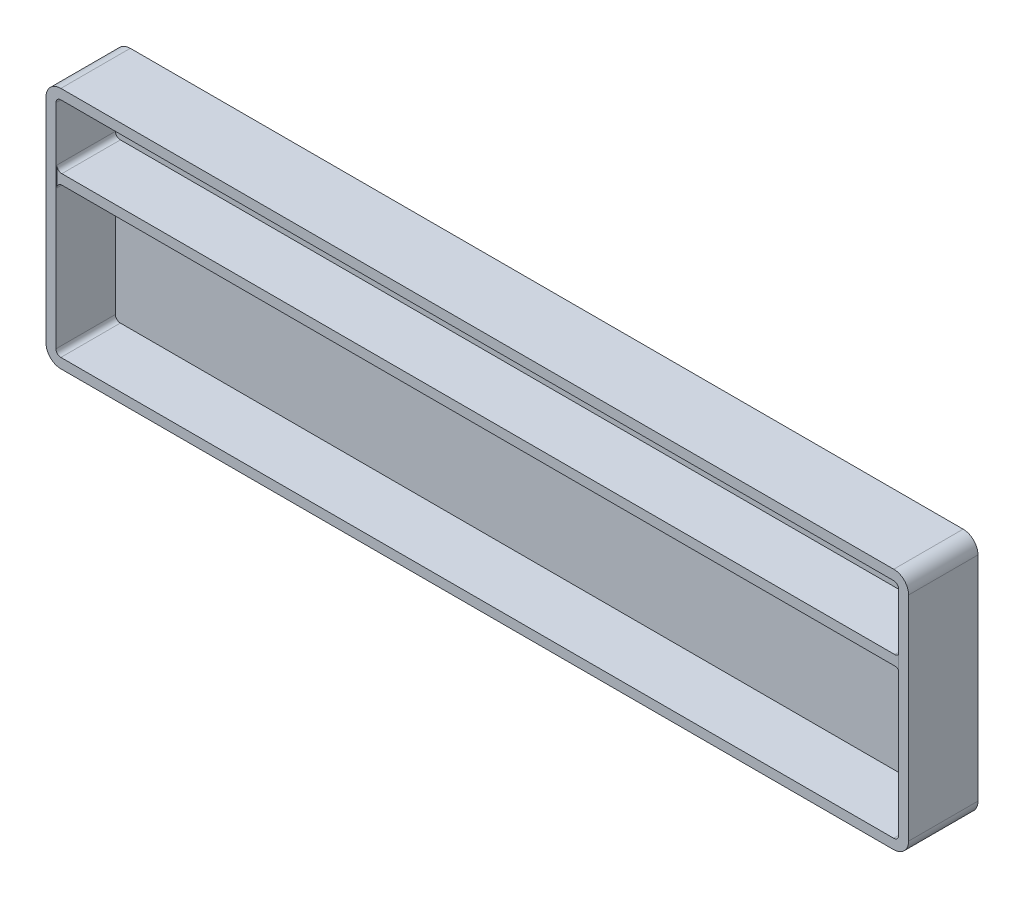
ISO-10303-21;
HEADER;
FILE_DESCRIPTION(('STEP AP214'),'2;1');
FILE_NAME('part.step','',(''),(''),'','','');
FILE_SCHEMA(('AUTOMOTIVE_DESIGN { 1 0 10303 214 1 1 1 1 }'));
ENDSEC;
DATA;
#1=APPLICATION_CONTEXT('core data for automotive mechanical design processes');
#2=APPLICATION_PROTOCOL_DEFINITION('international standard','automotive_design',2000,#1);
#3=PRODUCT_CONTEXT('',#1,'mechanical');
#4=PRODUCT('Part','Part','',(#3));
#5=PRODUCT_RELATED_PRODUCT_CATEGORY('part','',(#4));
#6=PRODUCT_DEFINITION_FORMATION('','',#4);
#7=PRODUCT_DEFINITION_CONTEXT('part definition',#1,'design');
#8=PRODUCT_DEFINITION('design','',#6,#7);
#9=PRODUCT_DEFINITION_SHAPE('','',#8);
#10=(LENGTH_UNIT() NAMED_UNIT(*) SI_UNIT(.MILLI.,.METRE.));
#11=(NAMED_UNIT(*) PLANE_ANGLE_UNIT() SI_UNIT($,.RADIAN.));
#12=(NAMED_UNIT(*) SI_UNIT($,.STERADIAN.) SOLID_ANGLE_UNIT());
#13=UNCERTAINTY_MEASURE_WITH_UNIT(LENGTH_MEASURE(1.E-05),#10,'distance_accuracy_value','');
#14=(GEOMETRIC_REPRESENTATION_CONTEXT(3) GLOBAL_UNCERTAINTY_ASSIGNED_CONTEXT((#13)) GLOBAL_UNIT_ASSIGNED_CONTEXT((#10,
#11,#12)) REPRESENTATION_CONTEXT('',''));
#15=CARTESIAN_POINT('',(0.,0.,0.));
#16=DIRECTION('',(0.,0.,1.));
#17=DIRECTION('',(1.,0.,0.));
#18=AXIS2_PLACEMENT_3D('',#15,#16,#17);
#19=CARTESIAN_POINT('',(0.,0.,12.));
#20=DIRECTION('',(0.,0.,-1.));
#21=DIRECTION('',(-1.,0.,0.));
#22=AXIS2_PLACEMENT_3D('',#19,#20,#21);
#23=PLANE('',#22);
#24=CARTESIAN_POINT('',(84.,21.5,12.));
#25=DIRECTION('',(0.,0.,-1.));
#26=DIRECTION('',(-1.,0.,0.));
#27=AXIS2_PLACEMENT_3D('',#24,#25,#26);
#28=CIRCLE('',#27,3.);
#29=CARTESIAN_POINT('',(87.,21.5,12.));
#30=VERTEX_POINT('',#29);
#31=CARTESIAN_POINT('',(84.,24.5,12.));
#32=VERTEX_POINT('',#31);
#33=EDGE_CURVE('E39',#30,#32,#28,.F.);
#34=ORIENTED_EDGE('',*,*,#33,.T.);
#35=DIRECTION('',(-1.,0.,0.));
#36=VECTOR('',#35,1.);
#37=CARTESIAN_POINT('',(-85.,24.5,12.));
#38=LINE('',#37,#36);
#39=CARTESIAN_POINT('',(-84.,24.5,12.));
#40=VERTEX_POINT('',#39);
#41=EDGE_CURVE('E319',#32,#40,#38,.T.);
#42=ORIENTED_EDGE('',*,*,#41,.T.);
#43=CARTESIAN_POINT('',(-84.,21.5,12.));
#44=DIRECTION('',(0.,0.,-1.));
#45=DIRECTION('',(-1.,0.,0.));
#46=AXIS2_PLACEMENT_3D('',#43,#44,#45);
#47=CIRCLE('',#46,3.);
#48=CARTESIAN_POINT('',(-87.,21.5,12.));
#49=VERTEX_POINT('',#48);
#50=EDGE_CURVE('E316',#40,#49,#47,.F.);
#51=ORIENTED_EDGE('',*,*,#50,.T.);
#52=DIRECTION('',(0.,-1.,0.));
#53=VECTOR('',#52,1.);
#54=CARTESIAN_POINT('',(-87.,22.5,12.));
#55=LINE('',#54,#53);
#56=CARTESIAN_POINT('',(-87.,-21.5,12.));
#57=VERTEX_POINT('',#56);
#58=EDGE_CURVE('E317',#49,#57,#55,.T.);
#59=ORIENTED_EDGE('',*,*,#58,.T.);
#60=CARTESIAN_POINT('',(-84.,-21.5,12.));
#61=DIRECTION('',(0.,0.,-1.));
#62=DIRECTION('',(-1.,0.,0.));
#63=AXIS2_PLACEMENT_3D('',#60,#61,#62);
#64=CIRCLE('',#63,3.);
#65=CARTESIAN_POINT('',(-84.,-24.5,12.));
#66=VERTEX_POINT('',#65);
#67=EDGE_CURVE('E59',#57,#66,#64,.F.);
#68=ORIENTED_EDGE('',*,*,#67,.T.);
#69=DIRECTION('',(1.,0.,0.));
#70=VECTOR('',#69,1.);
#71=CARTESIAN_POINT('',(-85.,-24.5,12.));
#72=LINE('',#71,#70);
#73=CARTESIAN_POINT('',(84.,-24.5,12.));
#74=VERTEX_POINT('',#73);
#75=EDGE_CURVE('E52',#66,#74,#72,.T.);
#76=ORIENTED_EDGE('',*,*,#75,.T.);
#77=CARTESIAN_POINT('',(84.,-21.5,12.));
#78=DIRECTION('',(0.,0.,-1.));
#79=DIRECTION('',(-1.,0.,0.));
#80=AXIS2_PLACEMENT_3D('',#77,#78,#79);
#81=CIRCLE('',#80,3.);
#82=CARTESIAN_POINT('',(87.,-21.5,12.));
#83=VERTEX_POINT('',#82);
#84=EDGE_CURVE('E323',#74,#83,#81,.F.);
#85=ORIENTED_EDGE('',*,*,#84,.T.);
#86=DIRECTION('',(0.,1.,0.));
#87=VECTOR('',#86,1.);
#88=CARTESIAN_POINT('',(87.,22.5,12.));
#89=LINE('',#88,#87);
#90=EDGE_CURVE('E206',#83,#30,#89,.T.);
#91=ORIENTED_EDGE('',*,*,#90,.T.);
#92=EDGE_LOOP('',(#34,#42,#51,#59,#68,#76,#85,#91));
#93=FACE_BOUND('',#92,.T.);
#94=DIRECTION('',(1.,0.,0.));
#95=VECTOR('',#94,1.);
#96=CARTESIAN_POINT('',(-85.,-22.5,12.));
#97=LINE('',#96,#95);
#98=CARTESIAN_POINT('',(-84.,-22.5,12.));
#99=VERTEX_POINT('',#98);
#100=CARTESIAN_POINT('',(84.,-22.5,12.));
#101=VERTEX_POINT('',#100);
#102=EDGE_CURVE('E609',#99,#101,#97,.T.);
#103=ORIENTED_EDGE('',*,*,#102,.F.);
#104=CARTESIAN_POINT('',(-84.,-21.5,12.));
#105=DIRECTION('',(0.,0.,1.));
#106=DIRECTION('',(1.,0.,0.));
#107=AXIS2_PLACEMENT_3D('',#104,#105,#106);
#108=CIRCLE('',#107,1.);
#109=CARTESIAN_POINT('',(-85.,-21.5,12.));
#110=VERTEX_POINT('',#109);
#111=EDGE_CURVE('E44',#99,#110,#108,.F.);
#112=ORIENTED_EDGE('',*,*,#111,.T.);
#113=DIRECTION('',(0.,-1.,0.));
#114=VECTOR('',#113,1.);
#115=CARTESIAN_POINT('',(-85.,22.5,12.));
#116=LINE('',#115,#114);
#117=CARTESIAN_POINT('',(-85.,21.5,12.));
#118=VERTEX_POINT('',#117);
#119=EDGE_CURVE('E637',#118,#110,#116,.T.);
#120=ORIENTED_EDGE('',*,*,#119,.F.);
#121=CARTESIAN_POINT('',(-84.,21.5,12.));
#122=DIRECTION('',(0.,0.,1.));
#123=DIRECTION('',(1.,0.,0.));
#124=AXIS2_PLACEMENT_3D('',#121,#122,#123);
#125=CIRCLE('',#124,1.);
#126=CARTESIAN_POINT('',(-84.,22.5,12.));
#127=VERTEX_POINT('',#126);
#128=EDGE_CURVE('E12',#118,#127,#125,.F.);
#129=ORIENTED_EDGE('',*,*,#128,.T.);
#130=DIRECTION('',(-1.,0.,0.));
#131=VECTOR('',#130,1.);
#132=CARTESIAN_POINT('',(-85.,22.5,12.));
#133=LINE('',#132,#131);
#134=CARTESIAN_POINT('',(84.,22.5,12.));
#135=VERTEX_POINT('',#134);
#136=EDGE_CURVE('E639',#135,#127,#133,.T.);
#137=ORIENTED_EDGE('',*,*,#136,.F.);
#138=CARTESIAN_POINT('',(84.,21.5,12.));
#139=DIRECTION('',(0.,0.,1.));
#140=DIRECTION('',(1.,0.,0.));
#141=AXIS2_PLACEMENT_3D('',#138,#139,#140);
#142=CIRCLE('',#141,1.);
#143=CARTESIAN_POINT('',(85.,21.5,12.));
#144=VERTEX_POINT('',#143);
#145=EDGE_CURVE('E254',#135,#144,#142,.F.);
#146=ORIENTED_EDGE('',*,*,#145,.T.);
#147=DIRECTION('',(0.,1.,0.));
#148=VECTOR('',#147,1.);
#149=CARTESIAN_POINT('',(85.,22.5,12.));
#150=LINE('',#149,#148);
#151=CARTESIAN_POINT('',(85.,-21.5,12.));
#152=VERTEX_POINT('',#151);
#153=EDGE_CURVE('E644',#152,#144,#150,.T.);
#154=ORIENTED_EDGE('',*,*,#153,.F.);
#155=CARTESIAN_POINT('',(84.,-21.5,12.));
#156=DIRECTION('',(0.,0.,1.));
#157=DIRECTION('',(1.,0.,0.));
#158=AXIS2_PLACEMENT_3D('',#155,#156,#157);
#159=CIRCLE('',#158,1.);
#160=EDGE_CURVE('E257',#152,#101,#159,.F.);
#161=ORIENTED_EDGE('',*,*,#160,.T.);
#162=EDGE_LOOP('',(#103,#112,#120,#129,#137,#146,#154,#161));
#163=FACE_BOUND('',#162,.T.);
#164=ADVANCED_FACE('F36',(#93,#163),#23,.F.);
#165=CARTESIAN_POINT('',(0.,0.,0.));
#166=DIRECTION('',(0.,0.,1.));
#167=DIRECTION('',(1.,0.,0.));
#168=AXIS2_PLACEMENT_3D('',#165,#166,#167);
#169=PLANE('',#168);
#170=DIRECTION('',(-1.,0.,0.));
#171=VECTOR('',#170,1.);
#172=CARTESIAN_POINT('',(-85.,9.5,0.));
#173=LINE('',#172,#171);
#174=CARTESIAN_POINT('',(84.,9.5,0.));
#175=VERTEX_POINT('',#174);
#176=CARTESIAN_POINT('',(-84.,9.5,0.));
#177=VERTEX_POINT('',#176);
#178=EDGE_CURVE('E617',#175,#177,#173,.T.);
#179=ORIENTED_EDGE('',*,*,#178,.F.);
#180=CARTESIAN_POINT('',(84.,10.5,0.));
#181=DIRECTION('',(0.,0.,1.));
#182=DIRECTION('',(1.,0.,0.));
#183=AXIS2_PLACEMENT_3D('',#180,#181,#182);
#184=CIRCLE('',#183,1.);
#185=CARTESIAN_POINT('',(85.,10.5,0.));
#186=VERTEX_POINT('',#185);
#187=EDGE_CURVE('E282',#175,#186,#184,.T.);
#188=ORIENTED_EDGE('',*,*,#187,.T.);
#189=DIRECTION('',(0.,1.,0.));
#190=VECTOR('',#189,1.);
#191=CARTESIAN_POINT('',(85.,22.5,0.));
#192=LINE('',#191,#190);
#193=CARTESIAN_POINT('',(85.,21.5,0.));
#194=VERTEX_POINT('',#193);
#195=EDGE_CURVE('E645',#186,#194,#192,.T.);
#196=ORIENTED_EDGE('',*,*,#195,.T.);
#197=CARTESIAN_POINT('',(84.,21.5,0.));
#198=DIRECTION('',(0.,0.,1.));
#199=DIRECTION('',(1.,0.,0.));
#200=AXIS2_PLACEMENT_3D('',#197,#198,#199);
#201=CIRCLE('',#200,1.);
#202=CARTESIAN_POINT('',(84.,22.5,0.));
#203=VERTEX_POINT('',#202);
#204=EDGE_CURVE('E280',#194,#203,#201,.T.);
#205=ORIENTED_EDGE('',*,*,#204,.T.);
#206=DIRECTION('',(-1.,0.,0.));
#207=VECTOR('',#206,1.);
#208=CARTESIAN_POINT('',(-85.,22.5,0.));
#209=LINE('',#208,#207);
#210=CARTESIAN_POINT('',(-84.,22.5,0.));
#211=VERTEX_POINT('',#210);
#212=EDGE_CURVE('E641',#203,#211,#209,.T.);
#213=ORIENTED_EDGE('',*,*,#212,.T.);
#214=CARTESIAN_POINT('',(-84.,21.5,0.));
#215=DIRECTION('',(0.,0.,1.));
#216=DIRECTION('',(1.,0.,0.));
#217=AXIS2_PLACEMENT_3D('',#214,#215,#216);
#218=CIRCLE('',#217,1.);
#219=CARTESIAN_POINT('',(-85.,21.5,0.));
#220=VERTEX_POINT('',#219);
#221=EDGE_CURVE('E276',#211,#220,#218,.T.);
#222=ORIENTED_EDGE('',*,*,#221,.T.);
#223=DIRECTION('',(0.,-1.,0.));
#224=VECTOR('',#223,1.);
#225=CARTESIAN_POINT('',(-85.,22.5,0.));
#226=LINE('',#225,#224);
#227=CARTESIAN_POINT('',(-85.,10.5,0.));
#228=VERTEX_POINT('',#227);
#229=EDGE_CURVE('E618',#220,#228,#226,.T.);
#230=ORIENTED_EDGE('',*,*,#229,.T.);
#231=CARTESIAN_POINT('',(-84.,10.5,0.));
#232=DIRECTION('',(0.,0.,1.));
#233=DIRECTION('',(1.,0.,0.));
#234=AXIS2_PLACEMENT_3D('',#231,#232,#233);
#235=CIRCLE('',#234,1.);
#236=EDGE_CURVE('E278',#228,#177,#235,.T.);
#237=ORIENTED_EDGE('',*,*,#236,.T.);
#238=EDGE_LOOP('',(#179,#188,#196,#205,#213,#222,#230,#237));
#239=FACE_BOUND('',#238,.T.);
#240=ADVANCED_FACE('F362',(#239),#169,.T.);
#241=DIRECTION('',(1.,0.,0.));
#242=VECTOR('',#241,1.);
#243=CARTESIAN_POINT('',(-85.,-22.5,0.));
#244=LINE('',#243,#242);
#245=CARTESIAN_POINT('',(-84.,-22.5,0.));
#246=VERTEX_POINT('',#245);
#247=CARTESIAN_POINT('',(84.,-22.5,0.));
#248=VERTEX_POINT('',#247);
#249=EDGE_CURVE('E634',#246,#248,#244,.T.);
#250=ORIENTED_EDGE('',*,*,#249,.T.);
#251=CARTESIAN_POINT('',(84.,-21.5,0.));
#252=DIRECTION('',(0.,0.,1.));
#253=DIRECTION('',(1.,0.,0.));
#254=AXIS2_PLACEMENT_3D('',#251,#252,#253);
#255=CIRCLE('',#254,1.);
#256=CARTESIAN_POINT('',(85.,-21.5,0.));
#257=VERTEX_POINT('',#256);
#258=EDGE_CURVE('E269',#248,#257,#255,.T.);
#259=ORIENTED_EDGE('',*,*,#258,.T.);
#260=CARTESIAN_POINT('',(85.,6.50000000000001,0.));
#261=VERTEX_POINT('',#260);
#262=EDGE_CURVE('E631',#257,#261,#192,.T.);
#263=ORIENTED_EDGE('',*,*,#262,.T.);
#264=CARTESIAN_POINT('',(84.,6.5,0.));
#265=DIRECTION('',(0.,0.,1.));
#266=DIRECTION('',(1.,0.,0.));
#267=AXIS2_PLACEMENT_3D('',#264,#265,#266);
#268=CIRCLE('',#267,1.);
#269=CARTESIAN_POINT('',(84.,7.5,0.));
#270=VERTEX_POINT('',#269);
#271=EDGE_CURVE('E267',#261,#270,#268,.T.);
#272=ORIENTED_EDGE('',*,*,#271,.T.);
#273=DIRECTION('',(1.,0.,0.));
#274=VECTOR('',#273,1.);
#275=CARTESIAN_POINT('',(-85.,7.5,0.));
#276=LINE('',#275,#274);
#277=CARTESIAN_POINT('',(-84.,7.5,0.));
#278=VERTEX_POINT('',#277);
#279=EDGE_CURVE('E620',#278,#270,#276,.T.);
#280=ORIENTED_EDGE('',*,*,#279,.F.);
#281=CARTESIAN_POINT('',(-84.,6.5,0.));
#282=DIRECTION('',(0.,0.,1.));
#283=DIRECTION('',(1.,0.,0.));
#284=AXIS2_PLACEMENT_3D('',#281,#282,#283);
#285=CIRCLE('',#284,1.);
#286=CARTESIAN_POINT('',(-85.,6.50000000000001,0.));
#287=VERTEX_POINT('',#286);
#288=EDGE_CURVE('E263',#278,#287,#285,.T.);
#289=ORIENTED_EDGE('',*,*,#288,.T.);
#290=CARTESIAN_POINT('',(-85.,-21.5,0.));
#291=VERTEX_POINT('',#290);
#292=EDGE_CURVE('E640',#287,#291,#226,.T.);
#293=ORIENTED_EDGE('',*,*,#292,.T.);
#294=CARTESIAN_POINT('',(-84.,-21.5,0.));
#295=DIRECTION('',(0.,0.,1.));
#296=DIRECTION('',(1.,0.,0.));
#297=AXIS2_PLACEMENT_3D('',#294,#295,#296);
#298=CIRCLE('',#297,1.);
#299=EDGE_CURVE('E265',#291,#246,#298,.T.);
#300=ORIENTED_EDGE('',*,*,#299,.T.);
#301=EDGE_LOOP('',(#250,#259,#263,#272,#280,#289,#293,#300));
#302=FACE_BOUND('',#301,.T.);
#303=ADVANCED_FACE('F367',(#302),#169,.T.);
#304=CARTESIAN_POINT('',(-85.,22.5,0.));
#305=DIRECTION('',(-1.,0.,0.));
#306=DIRECTION('',(0.,0.,1.));
#307=AXIS2_PLACEMENT_3D('',#304,#305,#306);
#308=PLANE('',#307);
#309=DIRECTION('',(0.,-1.,0.));
#310=VECTOR('',#309,1.);
#311=CARTESIAN_POINT('',(-85.,9.5,11.8));
#312=LINE('',#311,#310);
#313=CARTESIAN_POINT('',(-85.,10.5,11.8));
#314=VERTEX_POINT('',#313);
#315=CARTESIAN_POINT('',(-85.,6.5,11.8));
#316=VERTEX_POINT('',#315);
#317=EDGE_CURVE('E602',#314,#316,#312,.T.);
#318=ORIENTED_EDGE('',*,*,#317,.F.);
#319=DIRECTION('',(0.,0.,-1.));
#320=VECTOR('',#319,1.);
#321=CARTESIAN_POINT('',(-85.,10.5,0.));
#322=LINE('',#321,#320);
#323=EDGE_CURVE('E302',#314,#228,#322,.T.);
#324=ORIENTED_EDGE('',*,*,#323,.T.);
#325=ORIENTED_EDGE('',*,*,#229,.F.);
#326=DIRECTION('',(0.,0.,1.));
#327=VECTOR('',#326,1.);
#328=CARTESIAN_POINT('',(-85.,21.5,12.));
#329=LINE('',#328,#327);
#330=EDGE_CURVE('E294',#220,#118,#329,.T.);
#331=ORIENTED_EDGE('',*,*,#330,.T.);
#332=ORIENTED_EDGE('',*,*,#119,.T.);
#333=DIRECTION('',(0.,0.,1.));
#334=VECTOR('',#333,1.);
#335=CARTESIAN_POINT('',(-85.,-21.5,0.));
#336=LINE('',#335,#334);
#337=EDGE_CURVE('E300',#110,#291,#336,.F.);
#338=ORIENTED_EDGE('',*,*,#337,.T.);
#339=ORIENTED_EDGE('',*,*,#292,.F.);
#340=DIRECTION('',(0.,0.,-1.));
#341=VECTOR('',#340,1.);
#342=CARTESIAN_POINT('',(-85.,6.5,11.8000000000001));
#343=LINE('',#342,#341);
#344=EDGE_CURVE('E297',#287,#316,#343,.F.);
#345=ORIENTED_EDGE('',*,*,#344,.T.);
#346=EDGE_LOOP('',(#318,#324,#325,#331,#332,#338,#339,#345));
#347=FACE_BOUND('',#346,.T.);
#348=ADVANCED_FACE('F375',(#347),#308,.F.);
#349=CARTESIAN_POINT('',(85.,22.5,0.));
#350=DIRECTION('',(1.,0.,0.));
#351=DIRECTION('',(0.,0.,-1.));
#352=AXIS2_PLACEMENT_3D('',#349,#350,#351);
#353=PLANE('',#352);
#354=ORIENTED_EDGE('',*,*,#262,.F.);
#355=DIRECTION('',(0.,0.,1.));
#356=VECTOR('',#355,1.);
#357=CARTESIAN_POINT('',(85.,-21.5,12.));
#358=LINE('',#357,#356);
#359=EDGE_CURVE('E248',#257,#152,#358,.T.);
#360=ORIENTED_EDGE('',*,*,#359,.T.);
#361=ORIENTED_EDGE('',*,*,#153,.T.);
#362=DIRECTION('',(0.,0.,1.));
#363=VECTOR('',#362,1.);
#364=CARTESIAN_POINT('',(85.,21.5,0.));
#365=LINE('',#364,#363);
#366=EDGE_CURVE('E240',#144,#194,#365,.F.);
#367=ORIENTED_EDGE('',*,*,#366,.T.);
#368=ORIENTED_EDGE('',*,*,#195,.F.);
#369=DIRECTION('',(0.,0.,-1.));
#370=VECTOR('',#369,1.);
#371=CARTESIAN_POINT('',(85.,10.5,11.8000000000001));
#372=LINE('',#371,#370);
#373=CARTESIAN_POINT('',(85.,10.5,11.8));
#374=VERTEX_POINT('',#373);
#375=EDGE_CURVE('E245',#186,#374,#372,.F.);
#376=ORIENTED_EDGE('',*,*,#375,.T.);
#377=DIRECTION('',(0.,1.,0.));
#378=VECTOR('',#377,1.);
#379=CARTESIAN_POINT('',(85.,9.5,11.8));
#380=LINE('',#379,#378);
#381=CARTESIAN_POINT('',(85.,6.5,11.8));
#382=VERTEX_POINT('',#381);
#383=EDGE_CURVE('E627',#382,#374,#380,.T.);
#384=ORIENTED_EDGE('',*,*,#383,.F.);
#385=DIRECTION('',(0.,0.,-1.));
#386=VECTOR('',#385,1.);
#387=CARTESIAN_POINT('',(85.,6.5,0.));
#388=LINE('',#387,#386);
#389=EDGE_CURVE('E242',#382,#261,#388,.T.);
#390=ORIENTED_EDGE('',*,*,#389,.T.);
#391=EDGE_LOOP('',(#354,#360,#361,#367,#368,#376,#384,#390));
#392=FACE_BOUND('',#391,.T.);
#393=ADVANCED_FACE('F380',(#392),#353,.F.);
#394=CARTESIAN_POINT('',(-85.,-22.5,0.));
#395=DIRECTION('',(0.,-1.,0.));
#396=DIRECTION('',(0.,0.,-1.));
#397=AXIS2_PLACEMENT_3D('',#394,#395,#396);
#398=PLANE('',#397);
#399=ORIENTED_EDGE('',*,*,#102,.T.);
#400=DIRECTION('',(0.,0.,1.));
#401=VECTOR('',#400,1.);
#402=CARTESIAN_POINT('',(84.,-22.5,0.));
#403=LINE('',#402,#401);
#404=EDGE_CURVE('E261',#101,#248,#403,.F.);
#405=ORIENTED_EDGE('',*,*,#404,.T.);
#406=ORIENTED_EDGE('',*,*,#249,.F.);
#407=DIRECTION('',(0.,0.,1.));
#408=VECTOR('',#407,1.);
#409=CARTESIAN_POINT('',(-84.,-22.5,12.));
#410=LINE('',#409,#408);
#411=EDGE_CURVE('E250',#246,#99,#410,.T.);
#412=ORIENTED_EDGE('',*,*,#411,.T.);
#413=EDGE_LOOP('',(#399,#405,#406,#412));
#414=FACE_BOUND('',#413,.T.);
#415=ADVANCED_FACE('F554',(#414),#398,.F.);
#416=CARTESIAN_POINT('',(-85.,22.5,0.));
#417=DIRECTION('',(0.,1.,0.));
#418=DIRECTION('',(0.,0.,1.));
#419=AXIS2_PLACEMENT_3D('',#416,#417,#418);
#420=PLANE('',#419);
#421=ORIENTED_EDGE('',*,*,#212,.F.);
#422=DIRECTION('',(0.,0.,1.));
#423=VECTOR('',#422,1.);
#424=CARTESIAN_POINT('',(84.,22.5,12.));
#425=LINE('',#424,#423);
#426=EDGE_CURVE('E291',#203,#135,#425,.T.);
#427=ORIENTED_EDGE('',*,*,#426,.T.);
#428=ORIENTED_EDGE('',*,*,#136,.T.);
#429=DIRECTION('',(0.,0.,1.));
#430=VECTOR('',#429,1.);
#431=CARTESIAN_POINT('',(-84.,22.5,0.));
#432=LINE('',#431,#430);
#433=EDGE_CURVE('E289',#127,#211,#432,.F.);
#434=ORIENTED_EDGE('',*,*,#433,.T.);
#435=EDGE_LOOP('',(#421,#427,#428,#434));
#436=FACE_BOUND('',#435,.T.);
#437=ADVANCED_FACE('F545',(#436),#420,.F.);
#438=CARTESIAN_POINT('',(-85.,9.5,182.011764298827));
#439=DIRECTION('',(0.,-1.,0.));
#440=DIRECTION('',(0.,0.,-1.));
#441=AXIS2_PLACEMENT_3D('',#438,#439,#440);
#442=PLANE('',#441);
#443=DIRECTION('',(-1.,0.,0.));
#444=VECTOR('',#443,1.);
#445=CARTESIAN_POINT('',(-85.,9.5,11.8));
#446=LINE('',#445,#444);
#447=CARTESIAN_POINT('',(84.,9.5,11.8));
#448=VERTEX_POINT('',#447);
#449=CARTESIAN_POINT('',(-84.,9.5,11.8));
#450=VERTEX_POINT('',#449);
#451=EDGE_CURVE('E610',#448,#450,#446,.T.);
#452=ORIENTED_EDGE('',*,*,#451,.F.);
#453=DIRECTION('',(0.,0.,-1.));
#454=VECTOR('',#453,1.);
#455=CARTESIAN_POINT('',(84.,9.5,0.));
#456=LINE('',#455,#454);
#457=EDGE_CURVE('E273',#448,#175,#456,.T.);
#458=ORIENTED_EDGE('',*,*,#457,.T.);
#459=ORIENTED_EDGE('',*,*,#178,.T.);
#460=DIRECTION('',(0.,0.,-1.));
#461=VECTOR('',#460,1.);
#462=CARTESIAN_POINT('',(-84.,9.5,11.8000000000001));
#463=LINE('',#462,#461);
#464=EDGE_CURVE('E271',#177,#450,#463,.F.);
#465=ORIENTED_EDGE('',*,*,#464,.T.);
#466=EDGE_LOOP('',(#452,#458,#459,#465));
#467=FACE_BOUND('',#466,.T.);
#468=ADVANCED_FACE('F538',(#467),#442,.F.);
#469=CARTESIAN_POINT('',(-85.,7.5,182.011764298827));
#470=DIRECTION('',(0.,1.,0.));
#471=DIRECTION('',(0.,0.,1.));
#472=AXIS2_PLACEMENT_3D('',#469,#470,#471);
#473=PLANE('',#472);
#474=ORIENTED_EDGE('',*,*,#279,.T.);
#475=DIRECTION('',(0.,0.,-1.));
#476=VECTOR('',#475,1.);
#477=CARTESIAN_POINT('',(84.,7.5,11.8));
#478=LINE('',#477,#476);
#479=CARTESIAN_POINT('',(84.,7.5,11.8));
#480=VERTEX_POINT('',#479);
#481=EDGE_CURVE('E287',#270,#480,#478,.F.);
#482=ORIENTED_EDGE('',*,*,#481,.T.);
#483=DIRECTION('',(1.,0.,0.));
#484=VECTOR('',#483,1.);
#485=CARTESIAN_POINT('',(-85.,7.5,11.8));
#486=LINE('',#485,#484);
#487=CARTESIAN_POINT('',(-84.,7.5,11.8));
#488=VERTEX_POINT('',#487);
#489=EDGE_CURVE('E623',#488,#480,#486,.T.);
#490=ORIENTED_EDGE('',*,*,#489,.F.);
#491=DIRECTION('',(0.,0.,-1.));
#492=VECTOR('',#491,1.);
#493=CARTESIAN_POINT('',(-84.,7.5,0.));
#494=LINE('',#493,#492);
#495=EDGE_CURVE('E284',#488,#278,#494,.T.);
#496=ORIENTED_EDGE('',*,*,#495,.T.);
#497=EDGE_LOOP('',(#474,#482,#490,#496));
#498=FACE_BOUND('',#497,.T.);
#499=ADVANCED_FACE('F530',(#498),#473,.F.);
#500=CARTESIAN_POINT('',(0.,0.,11.8));
#501=DIRECTION('',(0.,0.,1.));
#502=DIRECTION('',(1.,0.,0.));
#503=AXIS2_PLACEMENT_3D('',#500,#501,#502);
#504=PLANE('',#503);
#505=ORIENTED_EDGE('',*,*,#317,.T.);
#506=CARTESIAN_POINT('',(-84.,6.5,11.8));
#507=DIRECTION('',(0.,0.,1.));
#508=DIRECTION('',(1.,0.,0.));
#509=AXIS2_PLACEMENT_3D('',#506,#507,#508);
#510=CIRCLE('',#509,1.);
#511=EDGE_CURVE('E313',#316,#488,#510,.F.);
#512=ORIENTED_EDGE('',*,*,#511,.T.);
#513=ORIENTED_EDGE('',*,*,#489,.T.);
#514=CARTESIAN_POINT('',(84.,6.5,11.8));
#515=DIRECTION('',(0.,0.,1.));
#516=DIRECTION('',(1.,0.,0.));
#517=AXIS2_PLACEMENT_3D('',#514,#515,#516);
#518=CIRCLE('',#517,1.);
#519=EDGE_CURVE('E307',#480,#382,#518,.F.);
#520=ORIENTED_EDGE('',*,*,#519,.T.);
#521=ORIENTED_EDGE('',*,*,#383,.T.);
#522=CARTESIAN_POINT('',(84.,10.5,11.8));
#523=DIRECTION('',(0.,0.,1.));
#524=DIRECTION('',(1.,0.,0.));
#525=AXIS2_PLACEMENT_3D('',#522,#523,#524);
#526=CIRCLE('',#525,1.);
#527=EDGE_CURVE('E305',#374,#448,#526,.F.);
#528=ORIENTED_EDGE('',*,*,#527,.T.);
#529=ORIENTED_EDGE('',*,*,#451,.T.);
#530=CARTESIAN_POINT('',(-84.,10.5,11.8));
#531=DIRECTION('',(0.,0.,1.));
#532=DIRECTION('',(1.,0.,0.));
#533=AXIS2_PLACEMENT_3D('',#530,#531,#532);
#534=CIRCLE('',#533,1.);
#535=EDGE_CURVE('E310',#450,#314,#534,.F.);
#536=ORIENTED_EDGE('',*,*,#535,.T.);
#537=EDGE_LOOP('',(#505,#512,#513,#520,#521,#528,#529,#536));
#538=FACE_BOUND('',#537,.T.);
#539=ADVANCED_FACE('F412',(#538),#504,.T.);
#540=CARTESIAN_POINT('',(84.,-21.5,0.));
#541=DIRECTION('',(0.,0.,-1.));
#542=DIRECTION('',(-1.,0.,0.));
#543=AXIS2_PLACEMENT_3D('',#540,#541,#542);
#544=CYLINDRICAL_SURFACE('',#543,1.);
#545=ORIENTED_EDGE('',*,*,#258,.F.);
#546=ORIENTED_EDGE('',*,*,#404,.F.);
#547=ORIENTED_EDGE('',*,*,#160,.F.);
#548=ORIENTED_EDGE('',*,*,#359,.F.);
#549=EDGE_LOOP('',(#545,#546,#547,#548));
#550=FACE_BOUND('',#549,.T.);
#551=ADVANCED_FACE('F406',(#550),#544,.F.);
#552=CARTESIAN_POINT('',(84.,10.5,182.011764298827));
#553=DIRECTION('',(0.,0.,1.));
#554=DIRECTION('',(1.,0.,0.));
#555=AXIS2_PLACEMENT_3D('',#552,#553,#554);
#556=CYLINDRICAL_SURFACE('',#555,1.);
#557=ORIENTED_EDGE('',*,*,#527,.F.);
#558=ORIENTED_EDGE('',*,*,#375,.F.);
#559=ORIENTED_EDGE('',*,*,#187,.F.);
#560=ORIENTED_EDGE('',*,*,#457,.F.);
#561=EDGE_LOOP('',(#557,#558,#559,#560));
#562=FACE_BOUND('',#561,.T.);
#563=ADVANCED_FACE('F411',(#562),#556,.F.);
#564=CARTESIAN_POINT('',(84.,6.5,0.));
#565=DIRECTION('',(0.,0.,1.));
#566=DIRECTION('',(1.,0.,0.));
#567=AXIS2_PLACEMENT_3D('',#564,#565,#566);
#568=CYLINDRICAL_SURFACE('',#567,1.);
#569=ORIENTED_EDGE('',*,*,#519,.F.);
#570=ORIENTED_EDGE('',*,*,#481,.F.);
#571=ORIENTED_EDGE('',*,*,#271,.F.);
#572=ORIENTED_EDGE('',*,*,#389,.F.);
#573=EDGE_LOOP('',(#569,#570,#571,#572));
#574=FACE_BOUND('',#573,.T.);
#575=ADVANCED_FACE('F421',(#574),#568,.F.);
#576=CARTESIAN_POINT('',(84.,21.5,0.));
#577=DIRECTION('',(0.,0.,-1.));
#578=DIRECTION('',(-1.,0.,0.));
#579=AXIS2_PLACEMENT_3D('',#576,#577,#578);
#580=CYLINDRICAL_SURFACE('',#579,1.);
#581=ORIENTED_EDGE('',*,*,#204,.F.);
#582=ORIENTED_EDGE('',*,*,#366,.F.);
#583=ORIENTED_EDGE('',*,*,#145,.F.);
#584=ORIENTED_EDGE('',*,*,#426,.F.);
#585=EDGE_LOOP('',(#581,#582,#583,#584));
#586=FACE_BOUND('',#585,.T.);
#587=ADVANCED_FACE('F430',(#586),#580,.F.);
#588=CARTESIAN_POINT('',(-84.,10.5,0.));
#589=DIRECTION('',(0.,0.,1.));
#590=DIRECTION('',(1.,0.,0.));
#591=AXIS2_PLACEMENT_3D('',#588,#589,#590);
#592=CYLINDRICAL_SURFACE('',#591,1.);
#593=ORIENTED_EDGE('',*,*,#535,.F.);
#594=ORIENTED_EDGE('',*,*,#464,.F.);
#595=ORIENTED_EDGE('',*,*,#236,.F.);
#596=ORIENTED_EDGE('',*,*,#323,.F.);
#597=EDGE_LOOP('',(#593,#594,#595,#596));
#598=FACE_BOUND('',#597,.T.);
#599=ADVANCED_FACE('F439',(#598),#592,.F.);
#600=CARTESIAN_POINT('',(-84.,-21.5,0.));
#601=DIRECTION('',(0.,0.,-1.));
#602=DIRECTION('',(-1.,0.,0.));
#603=AXIS2_PLACEMENT_3D('',#600,#601,#602);
#604=CYLINDRICAL_SURFACE('',#603,1.);
#605=ORIENTED_EDGE('',*,*,#299,.F.);
#606=ORIENTED_EDGE('',*,*,#337,.F.);
#607=ORIENTED_EDGE('',*,*,#111,.F.);
#608=ORIENTED_EDGE('',*,*,#411,.F.);
#609=EDGE_LOOP('',(#605,#606,#607,#608));
#610=FACE_BOUND('',#609,.T.);
#611=ADVANCED_FACE('F447',(#610),#604,.F.);
#612=CARTESIAN_POINT('',(-84.,6.5,182.011764298827));
#613=DIRECTION('',(0.,0.,1.));
#614=DIRECTION('',(1.,0.,0.));
#615=AXIS2_PLACEMENT_3D('',#612,#613,#614);
#616=CYLINDRICAL_SURFACE('',#615,1.);
#617=ORIENTED_EDGE('',*,*,#511,.F.);
#618=ORIENTED_EDGE('',*,*,#344,.F.);
#619=ORIENTED_EDGE('',*,*,#288,.F.);
#620=ORIENTED_EDGE('',*,*,#495,.F.);
#621=EDGE_LOOP('',(#617,#618,#619,#620));
#622=FACE_BOUND('',#621,.T.);
#623=ADVANCED_FACE('F456',(#622),#616,.F.);
#624=CARTESIAN_POINT('',(-84.,21.5,0.));
#625=DIRECTION('',(0.,0.,-1.));
#626=DIRECTION('',(-1.,0.,0.));
#627=AXIS2_PLACEMENT_3D('',#624,#625,#626);
#628=CYLINDRICAL_SURFACE('',#627,1.);
#629=ORIENTED_EDGE('',*,*,#221,.F.);
#630=ORIENTED_EDGE('',*,*,#433,.F.);
#631=ORIENTED_EDGE('',*,*,#128,.F.);
#632=ORIENTED_EDGE('',*,*,#330,.F.);
#633=EDGE_LOOP('',(#629,#630,#631,#632));
#634=FACE_BOUND('',#633,.T.);
#635=ADVANCED_FACE('F463',(#634),#628,.F.);
#636=CARTESIAN_POINT('',(0.,0.,-2.));
#637=DIRECTION('',(0.,0.,1.));
#638=DIRECTION('',(1.,0.,0.));
#639=AXIS2_PLACEMENT_3D('',#636,#637,#638);
#640=PLANE('',#639);
#641=DIRECTION('',(-1.,0.,0.));
#642=VECTOR('',#641,1.);
#643=CARTESIAN_POINT('',(0.,24.5,-2.));
#644=LINE('',#643,#642);
#645=CARTESIAN_POINT('',(84.,24.5,-2.));
#646=VERTEX_POINT('',#645);
#647=CARTESIAN_POINT('',(-84.,24.5,-2.));
#648=VERTEX_POINT('',#647);
#649=EDGE_CURVE('E220',#646,#648,#644,.T.);
#650=ORIENTED_EDGE('',*,*,#649,.F.);
#651=CARTESIAN_POINT('',(84.,21.5,-2.));
#652=DIRECTION('',(0.,0.,1.));
#653=DIRECTION('',(1.,0.,0.));
#654=AXIS2_PLACEMENT_3D('',#651,#652,#653);
#655=CIRCLE('',#654,3.);
#656=CARTESIAN_POINT('',(87.,21.5,-2.));
#657=VERTEX_POINT('',#656);
#658=EDGE_CURVE('E219',#646,#657,#655,.F.);
#659=ORIENTED_EDGE('',*,*,#658,.T.);
#660=DIRECTION('',(0.,1.,0.));
#661=VECTOR('',#660,1.);
#662=CARTESIAN_POINT('',(87.,0.,-2.));
#663=LINE('',#662,#661);
#664=CARTESIAN_POINT('',(87.,-21.5,-2.));
#665=VERTEX_POINT('',#664);
#666=EDGE_CURVE('E204',#665,#657,#663,.T.);
#667=ORIENTED_EDGE('',*,*,#666,.F.);
#668=CARTESIAN_POINT('',(84.,-21.5,-2.));
#669=DIRECTION('',(0.,0.,1.));
#670=DIRECTION('',(1.,0.,0.));
#671=AXIS2_PLACEMENT_3D('',#668,#669,#670);
#672=CIRCLE('',#671,3.);
#673=CARTESIAN_POINT('',(84.,-24.5,-2.));
#674=VERTEX_POINT('',#673);
#675=EDGE_CURVE('E216',#665,#674,#672,.F.);
#676=ORIENTED_EDGE('',*,*,#675,.T.);
#677=DIRECTION('',(1.,0.,0.));
#678=VECTOR('',#677,1.);
#679=CARTESIAN_POINT('',(0.,-24.5,-2.));
#680=LINE('',#679,#678);
#681=CARTESIAN_POINT('',(-84.,-24.5,-2.));
#682=VERTEX_POINT('',#681);
#683=EDGE_CURVE('E348',#682,#674,#680,.T.);
#684=ORIENTED_EDGE('',*,*,#683,.F.);
#685=CARTESIAN_POINT('',(-84.,-21.5,-2.));
#686=DIRECTION('',(0.,0.,1.));
#687=DIRECTION('',(1.,0.,0.));
#688=AXIS2_PLACEMENT_3D('',#685,#686,#687);
#689=CIRCLE('',#688,3.);
#690=CARTESIAN_POINT('',(-87.,-21.5,-2.));
#691=VERTEX_POINT('',#690);
#692=EDGE_CURVE('E229',#682,#691,#689,.F.);
#693=ORIENTED_EDGE('',*,*,#692,.T.);
#694=DIRECTION('',(0.,-1.,0.));
#695=VECTOR('',#694,1.);
#696=CARTESIAN_POINT('',(-87.,0.,-2.));
#697=LINE('',#696,#695);
#698=CARTESIAN_POINT('',(-87.,21.5,-2.));
#699=VERTEX_POINT('',#698);
#700=EDGE_CURVE('E347',#699,#691,#697,.T.);
#701=ORIENTED_EDGE('',*,*,#700,.F.);
#702=CARTESIAN_POINT('',(-84.,21.5,-2.));
#703=DIRECTION('',(0.,0.,1.));
#704=DIRECTION('',(1.,0.,0.));
#705=AXIS2_PLACEMENT_3D('',#702,#703,#704);
#706=CIRCLE('',#705,3.);
#707=EDGE_CURVE('E225',#699,#648,#706,.F.);
#708=ORIENTED_EDGE('',*,*,#707,.T.);
#709=EDGE_LOOP('',(#650,#659,#667,#676,#684,#693,#701,#708));
#710=FACE_BOUND('',#709,.T.);
#711=ADVANCED_FACE('F214',(#710),#640,.F.);
#712=CARTESIAN_POINT('',(-85.,-24.5,0.));
#713=DIRECTION('',(0.,-1.,0.));
#714=DIRECTION('',(0.,0.,-1.));
#715=AXIS2_PLACEMENT_3D('',#712,#713,#714);
#716=PLANE('',#715);
#717=ORIENTED_EDGE('',*,*,#75,.F.);
#718=DIRECTION('',(0.,0.,1.));
#719=VECTOR('',#718,1.);
#720=CARTESIAN_POINT('',(-84.,-24.5,0.));
#721=LINE('',#720,#719);
#722=EDGE_CURVE('E227',#66,#682,#721,.F.);
#723=ORIENTED_EDGE('',*,*,#722,.T.);
#724=ORIENTED_EDGE('',*,*,#683,.T.);
#725=DIRECTION('',(0.,0.,1.));
#726=VECTOR('',#725,1.);
#727=CARTESIAN_POINT('',(84.,-24.5,0.));
#728=LINE('',#727,#726);
#729=EDGE_CURVE('E224',#674,#74,#728,.T.);
#730=ORIENTED_EDGE('',*,*,#729,.T.);
#731=EDGE_LOOP('',(#717,#723,#724,#730));
#732=FACE_BOUND('',#731,.T.);
#733=ADVANCED_FACE('F482',(#732),#716,.T.);
#734=CARTESIAN_POINT('',(-87.,22.5,0.));
#735=DIRECTION('',(-1.,0.,0.));
#736=DIRECTION('',(0.,0.,1.));
#737=AXIS2_PLACEMENT_3D('',#734,#735,#736);
#738=PLANE('',#737);
#739=ORIENTED_EDGE('',*,*,#58,.F.);
#740=DIRECTION('',(0.,0.,1.));
#741=VECTOR('',#740,1.);
#742=CARTESIAN_POINT('',(-87.,21.5,0.));
#743=LINE('',#742,#741);
#744=EDGE_CURVE('E238',#49,#699,#743,.F.);
#745=ORIENTED_EDGE('',*,*,#744,.T.);
#746=ORIENTED_EDGE('',*,*,#700,.T.);
#747=DIRECTION('',(0.,0.,1.));
#748=VECTOR('',#747,1.);
#749=CARTESIAN_POINT('',(-87.,-21.5,0.));
#750=LINE('',#749,#748);
#751=EDGE_CURVE('E235',#691,#57,#750,.T.);
#752=ORIENTED_EDGE('',*,*,#751,.T.);
#753=EDGE_LOOP('',(#739,#745,#746,#752));
#754=FACE_BOUND('',#753,.T.);
#755=ADVANCED_FACE('F350',(#754),#738,.T.);
#756=CARTESIAN_POINT('',(-85.,24.5,0.));
#757=DIRECTION('',(0.,1.,0.));
#758=DIRECTION('',(0.,0.,1.));
#759=AXIS2_PLACEMENT_3D('',#756,#757,#758);
#760=PLANE('',#759);
#761=ORIENTED_EDGE('',*,*,#41,.F.);
#762=DIRECTION('',(0.,0.,1.));
#763=VECTOR('',#762,1.);
#764=CARTESIAN_POINT('',(84.,24.5,0.));
#765=LINE('',#764,#763);
#766=EDGE_CURVE('E340',#32,#646,#765,.F.);
#767=ORIENTED_EDGE('',*,*,#766,.T.);
#768=ORIENTED_EDGE('',*,*,#649,.T.);
#769=DIRECTION('',(0.,0.,1.));
#770=VECTOR('',#769,1.);
#771=CARTESIAN_POINT('',(-84.,24.5,0.));
#772=LINE('',#771,#770);
#773=EDGE_CURVE('E336',#648,#40,#772,.T.);
#774=ORIENTED_EDGE('',*,*,#773,.T.);
#775=EDGE_LOOP('',(#761,#767,#768,#774));
#776=FACE_BOUND('',#775,.T.);
#777=ADVANCED_FACE('F337',(#776),#760,.T.);
#778=CARTESIAN_POINT('',(87.,22.5,0.));
#779=DIRECTION('',(1.,0.,0.));
#780=DIRECTION('',(0.,0.,-1.));
#781=AXIS2_PLACEMENT_3D('',#778,#779,#780);
#782=PLANE('',#781);
#783=ORIENTED_EDGE('',*,*,#90,.F.);
#784=DIRECTION('',(0.,0.,1.));
#785=VECTOR('',#784,1.);
#786=CARTESIAN_POINT('',(87.,-21.5,0.));
#787=LINE('',#786,#785);
#788=EDGE_CURVE('E200',#83,#665,#787,.F.);
#789=ORIENTED_EDGE('',*,*,#788,.T.);
#790=ORIENTED_EDGE('',*,*,#666,.T.);
#791=DIRECTION('',(0.,0.,1.));
#792=VECTOR('',#791,1.);
#793=CARTESIAN_POINT('',(87.,21.5,0.));
#794=LINE('',#793,#792);
#795=EDGE_CURVE('E210',#657,#30,#794,.T.);
#796=ORIENTED_EDGE('',*,*,#795,.T.);
#797=EDGE_LOOP('',(#783,#789,#790,#796));
#798=FACE_BOUND('',#797,.T.);
#799=ADVANCED_FACE('F202',(#798),#782,.T.);
#800=CARTESIAN_POINT('',(84.,21.5,0.));
#801=DIRECTION('',(0.,0.,1.));
#802=DIRECTION('',(1.,0.,0.));
#803=AXIS2_PLACEMENT_3D('',#800,#801,#802);
#804=CYLINDRICAL_SURFACE('',#803,3.);
#805=ORIENTED_EDGE('',*,*,#33,.F.);
#806=ORIENTED_EDGE('',*,*,#795,.F.);
#807=ORIENTED_EDGE('',*,*,#658,.F.);
#808=ORIENTED_EDGE('',*,*,#766,.F.);
#809=EDGE_LOOP('',(#805,#806,#807,#808));
#810=FACE_BOUND('',#809,.T.);
#811=ADVANCED_FACE('F382',(#810),#804,.T.);
#812=CARTESIAN_POINT('',(84.,-21.5,0.));
#813=DIRECTION('',(0.,0.,1.));
#814=DIRECTION('',(1.,0.,0.));
#815=AXIS2_PLACEMENT_3D('',#812,#813,#814);
#816=CYLINDRICAL_SURFACE('',#815,3.);
#817=ORIENTED_EDGE('',*,*,#84,.F.);
#818=ORIENTED_EDGE('',*,*,#729,.F.);
#819=ORIENTED_EDGE('',*,*,#675,.F.);
#820=ORIENTED_EDGE('',*,*,#788,.F.);
#821=EDGE_LOOP('',(#817,#818,#819,#820));
#822=FACE_BOUND('',#821,.T.);
#823=ADVANCED_FACE('F223',(#822),#816,.T.);
#824=CARTESIAN_POINT('',(-84.,21.5,0.));
#825=DIRECTION('',(0.,0.,1.));
#826=DIRECTION('',(1.,0.,0.));
#827=AXIS2_PLACEMENT_3D('',#824,#825,#826);
#828=CYLINDRICAL_SURFACE('',#827,3.);
#829=ORIENTED_EDGE('',*,*,#50,.F.);
#830=ORIENTED_EDGE('',*,*,#773,.F.);
#831=ORIENTED_EDGE('',*,*,#707,.F.);
#832=ORIENTED_EDGE('',*,*,#744,.F.);
#833=EDGE_LOOP('',(#829,#830,#831,#832));
#834=FACE_BOUND('',#833,.T.);
#835=ADVANCED_FACE('F354',(#834),#828,.T.);
#836=CARTESIAN_POINT('',(-84.,-21.5,0.));
#837=DIRECTION('',(0.,0.,1.));
#838=DIRECTION('',(1.,0.,0.));
#839=AXIS2_PLACEMENT_3D('',#836,#837,#838);
#840=CYLINDRICAL_SURFACE('',#839,3.);
#841=ORIENTED_EDGE('',*,*,#67,.F.);
#842=ORIENTED_EDGE('',*,*,#751,.F.);
#843=ORIENTED_EDGE('',*,*,#692,.F.);
#844=ORIENTED_EDGE('',*,*,#722,.F.);
#845=EDGE_LOOP('',(#841,#842,#843,#844));
#846=FACE_BOUND('',#845,.T.);
#847=ADVANCED_FACE('F352',(#846),#840,.T.);
#848=CLOSED_SHELL('',(#164,#240,#303,#348,#393,#415,#437,#468,#499,#539,#551,#563,#575,#587,
#599,#611,#623,#635,#711,#733,#755,#777,#799,#811,#823,#835,#847));
#849=MANIFOLD_SOLID_BREP('B2',#848);
#850=ADVANCED_BREP_SHAPE_REPRESENTATION('',(#18,#849),#14);
#851=SHAPE_DEFINITION_REPRESENTATION(#9,#850);
ENDSEC;
END-ISO-10303-21;
